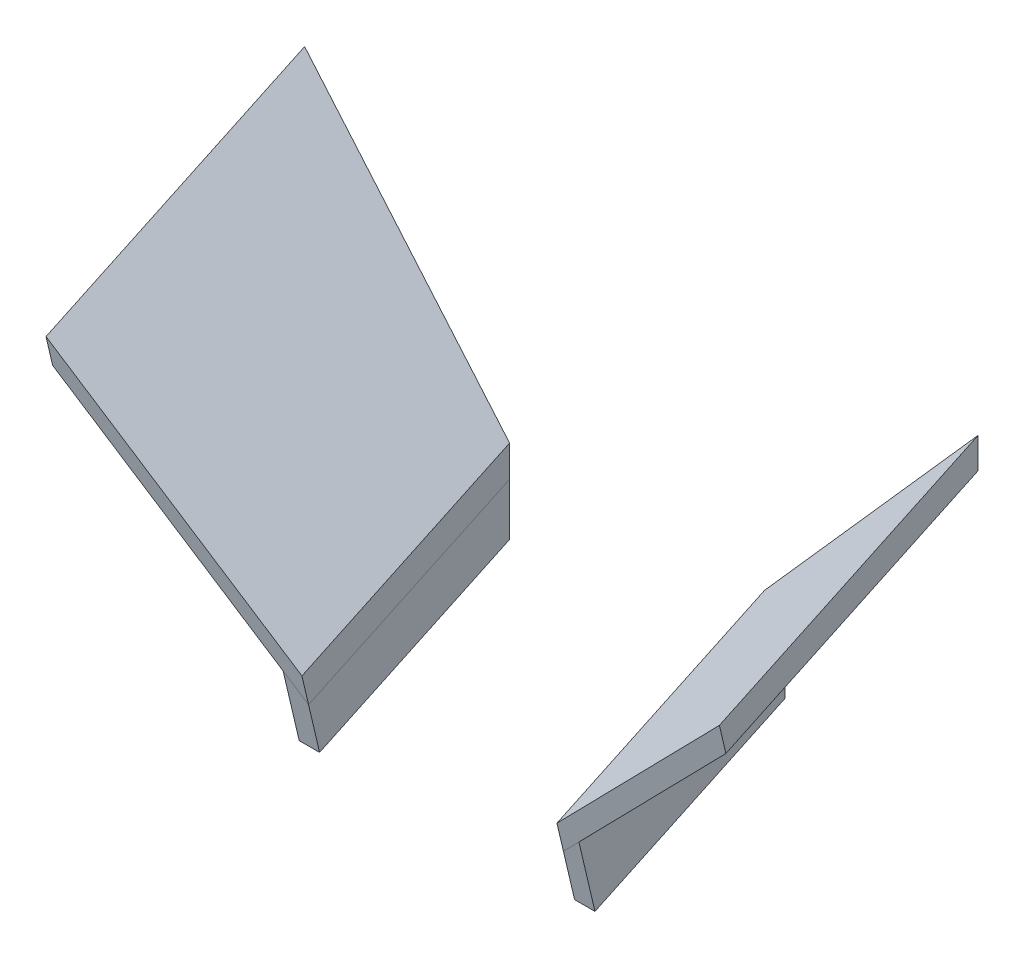
ISO-10303-21;
HEADER;
FILE_DESCRIPTION(('STEP AP214'),'2;1');
FILE_NAME('part.step','',(''),(''),'','','');
FILE_SCHEMA(('AUTOMOTIVE_DESIGN { 1 0 10303 214 1 1 1 1 }'));
ENDSEC;
DATA;
#1=APPLICATION_CONTEXT('core data for automotive mechanical design processes');
#2=APPLICATION_PROTOCOL_DEFINITION('international standard','automotive_design',2000,#1);
#3=PRODUCT_CONTEXT('',#1,'mechanical');
#4=PRODUCT('Part','Part','',(#3));
#5=PRODUCT_RELATED_PRODUCT_CATEGORY('part','',(#4));
#6=PRODUCT_DEFINITION_FORMATION('','',#4);
#7=PRODUCT_DEFINITION_CONTEXT('part definition',#1,'design');
#8=PRODUCT_DEFINITION('design','',#6,#7);
#9=PRODUCT_DEFINITION_SHAPE('','',#8);
#10=(LENGTH_UNIT() NAMED_UNIT(*) SI_UNIT(.MILLI.,.METRE.));
#11=(NAMED_UNIT(*) PLANE_ANGLE_UNIT() SI_UNIT($,.RADIAN.));
#12=(NAMED_UNIT(*) SI_UNIT($,.STERADIAN.) SOLID_ANGLE_UNIT());
#13=UNCERTAINTY_MEASURE_WITH_UNIT(LENGTH_MEASURE(1.E-05),#10,'distance_accuracy_value','');
#14=(GEOMETRIC_REPRESENTATION_CONTEXT(3) GLOBAL_UNCERTAINTY_ASSIGNED_CONTEXT((#13)) GLOBAL_UNIT_ASSIGNED_CONTEXT((#10,
#11,#12)) REPRESENTATION_CONTEXT('',''));
#15=CARTESIAN_POINT('',(0.,0.,0.));
#16=DIRECTION('',(0.,0.,1.));
#17=DIRECTION('',(1.,0.,0.));
#18=AXIS2_PLACEMENT_3D('',#15,#16,#17);
#19=CARTESIAN_POINT('',(-609.599999999917,189.561431206279,266.208589776236));
#20=DIRECTION('',(0.,-0.228725313452446,0.973491002005709));
#21=DIRECTION('',(-1.,0.,0.));
#22=AXIS2_PLACEMENT_3D('',#19,#20,#21);
#23=PLANE('',#22);
#24=DIRECTION('',(-1.,0.,0.));
#25=VECTOR('',#24,1.);
#26=CARTESIAN_POINT('',(-609.599999999917,-218.518699240679,170.328652973648));
#27=LINE('',#26,#25);
#28=CARTESIAN_POINT('',(-173.037499999917,-218.518699240679,170.328652973649));
#29=VERTEX_POINT('',#28);
#30=CARTESIAN_POINT('',(-191.293749999917,-218.518699240679,170.328652973648));
#31=VERTEX_POINT('',#30);
#32=EDGE_CURVE('E103',#29,#31,#27,.T.);
#33=ORIENTED_EDGE('',*,*,#32,.F.);
#34=DIRECTION('',(0.,-0.973491002005709,-0.228725313452446));
#35=VECTOR('',#34,1.);
#36=CARTESIAN_POINT('',(-173.037499999917,-105.971152820937,196.772115501932));
#37=LINE('',#36,#35);
#38=CARTESIAN_POINT('',(-173.037499999917,-157.427508899888,184.682254220184));
#39=VERTEX_POINT('',#38);
#40=EDGE_CURVE('E12',#39,#29,#37,.T.);
#41=ORIENTED_EDGE('',*,*,#40,.F.);
#42=DIRECTION('',(-0.691779980186067,-0.70296597437267,-0.165164457096698));
#43=VECTOR('',#42,1.);
#44=CARTESIAN_POINT('',(-66.7796089213839,-49.451441253763,210.051630893249));
#45=LINE('',#44,#43);
#46=CARTESIAN_POINT('',(-191.293749999917,-175.978960137592,180.323522099806));
#47=VERTEX_POINT('',#46);
#48=EDGE_CURVE('E98',#39,#47,#45,.T.);
#49=ORIENTED_EDGE('',*,*,#48,.T.);
#50=DIRECTION('',(0.,-0.973491002005709,-0.228725313452446));
#51=VECTOR('',#50,1.);
#52=CARTESIAN_POINT('',(-191.293749999917,-105.971152820937,196.772115501932));
#53=LINE('',#52,#51);
#54=EDGE_CURVE('E102',#47,#31,#53,.T.);
#55=ORIENTED_EDGE('',*,*,#54,.T.);
#56=EDGE_LOOP('',(#33,#41,#49,#55));
#57=FACE_BOUND('',#56,.T.);
#58=ADVANCED_FACE('F60',(#57),#23,.T.);
#59=CARTESIAN_POINT('',(0.,0.,0.));
#60=DIRECTION('',(0.,0.,1.));
#61=DIRECTION('',(1.,0.,0.));
#62=AXIS2_PLACEMENT_3D('',#59,#60,#61);
#63=PLANE('',#62);
#64=DIRECTION('',(0.,-1.,0.));
#65=VECTOR('',#64,1.);
#66=CARTESIAN_POINT('',(-173.037499999917,0.,0.));
#67=LINE('',#66,#65);
#68=CARTESIAN_POINT('',(-173.037499999917,-70.4358591762382,0.));
#69=VERTEX_POINT('',#68);
#70=CARTESIAN_POINT('',(-173.037499999917,-138.364039017786,0.));
#71=VERTEX_POINT('',#70);
#72=EDGE_CURVE('E110',#69,#71,#67,.T.);
#73=ORIENTED_EDGE('',*,*,#72,.T.);
#74=DIRECTION('',(1.,0.,0.));
#75=VECTOR('',#74,1.);
#76=CARTESIAN_POINT('',(-603.646875,-138.364039017786,-3.87855656383673E-13));
#77=LINE('',#76,#75);
#78=CARTESIAN_POINT('',(-191.293749999917,-138.364039017786,-1.22910208005818E-13));
#79=VERTEX_POINT('',#78);
#80=EDGE_CURVE('E76',#79,#71,#77,.T.);
#81=ORIENTED_EDGE('',*,*,#80,.F.);
#82=DIRECTION('',(0.,-1.,0.));
#83=VECTOR('',#82,1.);
#84=CARTESIAN_POINT('',(-191.293749999917,1.19448110160142E-13,0.));
#85=LINE('',#84,#83);
#86=CARTESIAN_POINT('',(-191.293749999917,-91.040422118995,0.));
#87=VERTEX_POINT('',#86);
#88=EDGE_CURVE('E109',#87,#79,#85,.T.);
#89=ORIENTED_EDGE('',*,*,#88,.F.);
#90=DIRECTION('',(-0.663167433478709,-0.748471078381297,0.));
#91=VECTOR('',#90,1.);
#92=CARTESIAN_POINT('',(-61.9754982176188,54.9121178876129,0.));
#93=LINE('',#92,#91);
#94=EDGE_CURVE('E68',#69,#87,#93,.T.);
#95=ORIENTED_EDGE('',*,*,#94,.F.);
#96=EDGE_LOOP('',(#73,#81,#89,#95));
#97=FACE_BOUND('',#96,.T.);
#98=ADVANCED_FACE('F133',(#97),#63,.F.);
#99=CARTESIAN_POINT('',(-191.293749999917,-119.192513358351,253.04431084039));
#100=DIRECTION('',(1.,0.,0.));
#101=DIRECTION('',(0.,1.,0.));
#102=AXIS2_PLACEMENT_3D('',#99,#100,#101);
#103=PLANE('',#102);
#104=ORIENTED_EDGE('',*,*,#88,.T.);
#105=DIRECTION('',(0.,-0.42579703632988,0.904818702200994));
#106=VECTOR('',#105,1.);
#107=CARTESIAN_POINT('',(-191.293749999917,-232.378341091693,199.780391907053));
#108=LINE('',#107,#106);
#109=EDGE_CURVE('E113',#79,#31,#108,.T.);
#110=ORIENTED_EDGE('',*,*,#109,.T.);
#111=ORIENTED_EDGE('',*,*,#54,.F.);
#112=DIRECTION('',(0.,0.426127276803473,-0.904663221295116));
#113=VECTOR('',#112,1.);
#114=CARTESIAN_POINT('',(-191.293749999917,-210.232935477346,253.04431084039));
#115=LINE('',#114,#113);
#116=EDGE_CURVE('E63',#47,#87,#115,.T.);
#117=ORIENTED_EDGE('',*,*,#116,.T.);
#118=EDGE_LOOP('',(#104,#110,#111,#117));
#119=FACE_BOUND('',#118,.T.);
#120=ADVANCED_FACE('F112',(#119),#103,.F.);
#121=CARTESIAN_POINT('',(-61.975498217619,-64.2803954707384,253.04431084039));
#122=DIRECTION('',(0.714426177411708,-0.633002647889575,-0.298165867922002));
#123=DIRECTION('',(0.663167433478709,0.748471078381298,0.));
#124=AXIS2_PLACEMENT_3D('',#121,#122,#123);
#125=PLANE('',#124);
#126=ORIENTED_EDGE('',*,*,#48,.F.);
#127=DIRECTION('',(0.,0.426127276803473,-0.904663221295116));
#128=VECTOR('',#127,1.);
#129=CARTESIAN_POINT('',(-173.037499999917,-189.628372534589,253.04431084039));
#130=LINE('',#129,#128);
#131=EDGE_CURVE('E85',#39,#69,#130,.T.);
#132=ORIENTED_EDGE('',*,*,#131,.T.);
#133=ORIENTED_EDGE('',*,*,#94,.T.);
#134=ORIENTED_EDGE('',*,*,#116,.F.);
#135=EDGE_LOOP('',(#126,#132,#133,#134));
#136=FACE_BOUND('',#135,.T.);
#137=ADVANCED_FACE('F105',(#136),#125,.F.);
#138=CARTESIAN_POINT('',(-173.037499999917,-119.192513358351,253.04431084039));
#139=DIRECTION('',(1.,0.,0.));
#140=DIRECTION('',(0.,0.,-1.));
#141=AXIS2_PLACEMENT_3D('',#138,#139,#140);
#142=PLANE('',#141);
#143=DIRECTION('',(0.,-0.42579703632988,0.904818702200994));
#144=VECTOR('',#143,1.);
#145=CARTESIAN_POINT('',(-173.037499999917,-138.364039017786,-1.11180188154635E-13));
#146=LINE('',#145,#144);
#147=EDGE_CURVE('E125',#71,#29,#146,.T.);
#148=ORIENTED_EDGE('',*,*,#147,.F.);
#149=ORIENTED_EDGE('',*,*,#72,.F.);
#150=ORIENTED_EDGE('',*,*,#131,.F.);
#151=ORIENTED_EDGE('',*,*,#40,.T.);
#152=EDGE_LOOP('',(#148,#149,#150,#151));
#153=FACE_BOUND('',#152,.T.);
#154=ADVANCED_FACE('F131',(#153),#142,.T.);
#155=CARTESIAN_POINT('',(-603.646875,-138.364039017786,-3.87855656383673E-13));
#156=DIRECTION('',(0.,0.904818702200994,0.42579703632988));
#157=DIRECTION('',(0.,-0.42579703632988,0.904818702200994));
#158=AXIS2_PLACEMENT_3D('',#155,#156,#157);
#159=PLANE('',#158);
#160=ORIENTED_EDGE('',*,*,#32,.T.);
#161=ORIENTED_EDGE('',*,*,#109,.F.);
#162=ORIENTED_EDGE('',*,*,#80,.T.);
#163=ORIENTED_EDGE('',*,*,#147,.T.);
#164=EDGE_LOOP('',(#160,#161,#162,#163));
#165=FACE_BOUND('',#164,.T.);
#166=ADVANCED_FACE('F127',(#165),#159,.F.);
#167=CLOSED_SHELL('',(#58,#98,#120,#137,#154,#166));
#168=MANIFOLD_SOLID_BREP('B2_NOT_SHOWN',#167);
#169=CARTESIAN_POINT('',(-288.754784271006,-364.952575901978,253.04431084039));
#170=DIRECTION('',(0.728338497084429,0.619891078335886,0.291989870824946));
#171=DIRECTION('',(-0.648135927567824,0.761524667621343,0.));
#172=AXIS2_PLACEMENT_3D('',#169,#170,#171);
#173=PLANE('',#172);
#174=DIRECTION('',(0.,0.426127276803473,-0.904663221295116));
#175=VECTOR('',#174,1.);
#176=CARTESIAN_POINT('',(-438.149999999917,-189.42127581019,253.04431084039));
#177=LINE('',#176,#175);
#178=CARTESIAN_POINT('',(-438.149999999917,-157.241048027369,184.726063892205));
#179=VERTEX_POINT('',#178);
#180=CARTESIAN_POINT('',(-438.149999999917,-70.2287624518382,0.));
#181=VERTEX_POINT('',#180);
#182=EDGE_CURVE('E252',#179,#181,#177,.T.);
#183=ORIENTED_EDGE('',*,*,#182,.F.);
#184=DIRECTION('',(0.677150882640662,-0.716337704578502,-0.1683061945924));
#185=VECTOR('',#184,1.);
#186=CARTESIAN_POINT('',(-276.679094390703,-328.056298875526,144.592388581179));
#187=LINE('',#186,#185);
#188=CARTESIAN_POINT('',(-419.893749999917,-176.553789920598,180.188463715056));
#189=VERTEX_POINT('',#188);
#190=EDGE_CURVE('E239',#179,#189,#187,.T.);
#191=ORIENTED_EDGE('',*,*,#190,.T.);
#192=DIRECTION('',(0.,0.426127276803473,-0.904663221295116));
#193=VECTOR('',#192,1.);
#194=CARTESIAN_POINT('',(-419.893749999917,-210.871382372608,253.04431084039));
#195=LINE('',#194,#193);
#196=CARTESIAN_POINT('',(-419.893749999917,-91.6788690142571,0.));
#197=VERTEX_POINT('',#196);
#198=EDGE_CURVE('E256',#189,#197,#195,.T.);
#199=ORIENTED_EDGE('',*,*,#198,.T.);
#200=DIRECTION('',(0.648135927567824,-0.761524667621343,0.));
#201=VECTOR('',#200,1.);
#202=CARTESIAN_POINT('',(-288.754784271006,-245.760062543627,0.));
#203=LINE('',#202,#201);
#204=EDGE_CURVE('E254',#181,#197,#203,.T.);
#205=ORIENTED_EDGE('',*,*,#204,.F.);
#206=EDGE_LOOP('',(#183,#191,#199,#205));
#207=FACE_BOUND('',#206,.T.);
#208=ADVANCED_FACE('F194',(#207),#173,.T.);
#209=CARTESIAN_POINT('',(-438.149999999917,-119.192513358351,253.04431084039));
#210=DIRECTION('',(1.,0.,0.));
#211=DIRECTION('',(0.,0.,-1.));
#212=AXIS2_PLACEMENT_3D('',#209,#210,#211);
#213=PLANE('',#212);
#214=DIRECTION('',(0.,-1.,0.));
#215=VECTOR('',#214,1.);
#216=CARTESIAN_POINT('',(-438.149999999917,0.,0.));
#217=LINE('',#216,#215);
#218=CARTESIAN_POINT('',(-438.149999999917,-138.364039017786,-2.81520476428332E-13));
#219=VERTEX_POINT('',#218);
#220=EDGE_CURVE('E246',#181,#219,#217,.T.);
#221=ORIENTED_EDGE('',*,*,#220,.T.);
#222=DIRECTION('',(0.,-0.42579703632988,0.904818702200994));
#223=VECTOR('',#222,1.);
#224=CARTESIAN_POINT('',(-438.149999999917,-232.378341091693,199.780391907053));
#225=LINE('',#224,#223);
#226=CARTESIAN_POINT('',(-438.149999999917,-218.518699240679,170.328652973648));
#227=VERTEX_POINT('',#226);
#228=EDGE_CURVE('E232',#219,#227,#225,.T.);
#229=ORIENTED_EDGE('',*,*,#228,.T.);
#230=DIRECTION('',(0.,-0.973491002005709,-0.228725313452446));
#231=VECTOR('',#230,1.);
#232=CARTESIAN_POINT('',(-438.149999999917,-105.971152820937,196.772115501932));
#233=LINE('',#232,#231);
#234=EDGE_CURVE('E260',#179,#227,#233,.T.);
#235=ORIENTED_EDGE('',*,*,#234,.F.);
#236=ORIENTED_EDGE('',*,*,#182,.T.);
#237=EDGE_LOOP('',(#221,#229,#235,#236));
#238=FACE_BOUND('',#237,.T.);
#239=ADVANCED_FACE('F250',(#238),#213,.F.);
#240=CARTESIAN_POINT('',(-419.893749999917,-119.192513358351,253.04431084039));
#241=DIRECTION('',(-1.,0.,0.));
#242=DIRECTION('',(0.,-1.,0.));
#243=AXIS2_PLACEMENT_3D('',#240,#241,#242);
#244=PLANE('',#243);
#245=DIRECTION('',(0.,0.973491002005709,0.228725313452446));
#246=VECTOR('',#245,1.);
#247=CARTESIAN_POINT('',(-419.893749999917,-105.971152820936,196.772115501932));
#248=LINE('',#247,#246);
#249=CARTESIAN_POINT('',(-419.893749999917,-218.518699240679,170.328652973648));
#250=VERTEX_POINT('',#249);
#251=EDGE_CURVE('E202',#250,#189,#248,.T.);
#252=ORIENTED_EDGE('',*,*,#251,.F.);
#253=DIRECTION('',(0.,0.42579703632988,-0.904818702200994));
#254=VECTOR('',#253,1.);
#255=CARTESIAN_POINT('',(-419.893749999917,-232.378341091693,199.780391907053));
#256=LINE('',#255,#254);
#257=CARTESIAN_POINT('',(-419.893749999917,-138.364039017786,-2.69790456577149E-13));
#258=VERTEX_POINT('',#257);
#259=EDGE_CURVE('E208',#250,#258,#256,.T.);
#260=ORIENTED_EDGE('',*,*,#259,.T.);
#261=DIRECTION('',(0.,1.,0.));
#262=VECTOR('',#261,1.);
#263=CARTESIAN_POINT('',(-419.893749999917,5.24382159956268E-13,0.));
#264=LINE('',#263,#262);
#265=EDGE_CURVE('E248',#258,#197,#264,.T.);
#266=ORIENTED_EDGE('',*,*,#265,.T.);
#267=ORIENTED_EDGE('',*,*,#198,.F.);
#268=EDGE_LOOP('',(#252,#260,#266,#267));
#269=FACE_BOUND('',#268,.T.);
#270=ADVANCED_FACE('F267',(#269),#244,.F.);
#271=CARTESIAN_POINT('',(0.,0.,0.));
#272=DIRECTION('',(0.,0.,1.));
#273=DIRECTION('',(1.,0.,0.));
#274=AXIS2_PLACEMENT_3D('',#271,#272,#273);
#275=PLANE('',#274);
#276=ORIENTED_EDGE('',*,*,#265,.F.);
#277=DIRECTION('',(1.,0.,0.));
#278=VECTOR('',#277,1.);
#279=CARTESIAN_POINT('',(-603.646875,-138.364039017786,-3.87855656383673E-13));
#280=LINE('',#279,#278);
#281=EDGE_CURVE('E235',#219,#258,#280,.T.);
#282=ORIENTED_EDGE('',*,*,#281,.F.);
#283=ORIENTED_EDGE('',*,*,#220,.F.);
#284=ORIENTED_EDGE('',*,*,#204,.T.);
#285=EDGE_LOOP('',(#276,#282,#283,#284));
#286=FACE_BOUND('',#285,.T.);
#287=ADVANCED_FACE('F244',(#286),#275,.F.);
#288=CARTESIAN_POINT('',(-609.599999999917,189.561431206279,266.208589776236));
#289=DIRECTION('',(0.,-0.228725313452446,0.973491002005709));
#290=DIRECTION('',(-1.,0.,0.));
#291=AXIS2_PLACEMENT_3D('',#288,#289,#290);
#292=PLANE('',#291);
#293=DIRECTION('',(-1.,0.,0.));
#294=VECTOR('',#293,1.);
#295=CARTESIAN_POINT('',(-609.599999999917,-218.518699240679,170.328652973648));
#296=LINE('',#295,#294);
#297=EDGE_CURVE('E58',#250,#227,#296,.T.);
#298=ORIENTED_EDGE('',*,*,#297,.F.);
#299=ORIENTED_EDGE('',*,*,#251,.T.);
#300=ORIENTED_EDGE('',*,*,#190,.F.);
#301=ORIENTED_EDGE('',*,*,#234,.T.);
#302=EDGE_LOOP('',(#298,#299,#300,#301));
#303=FACE_BOUND('',#302,.T.);
#304=ADVANCED_FACE('F196',(#303),#292,.T.);
#305=CARTESIAN_POINT('',(-603.646875,-138.364039017786,-3.87855656383673E-13));
#306=DIRECTION('',(0.,0.904818702200994,0.42579703632988));
#307=DIRECTION('',(0.,-0.42579703632988,0.904818702200994));
#308=AXIS2_PLACEMENT_3D('',#305,#306,#307);
#309=PLANE('',#308);
#310=ORIENTED_EDGE('',*,*,#281,.T.);
#311=ORIENTED_EDGE('',*,*,#259,.F.);
#312=ORIENTED_EDGE('',*,*,#297,.T.);
#313=ORIENTED_EDGE('',*,*,#228,.F.);
#314=EDGE_LOOP('',(#310,#311,#312,#313));
#315=FACE_BOUND('',#314,.T.);
#316=ADVANCED_FACE('F234',(#315),#309,.F.);
#317=CLOSED_SHELL('',(#208,#239,#270,#287,#304,#316));
#318=MANIFOLD_SOLID_BREP('B6',#317);
#319=CARTESIAN_POINT('',(-61.9754982176192,-175.556296081528,489.281745473094));
#320=DIRECTION('',(0.714426177411708,-0.633002647889575,-0.298165867922002));
#321=DIRECTION('',(0.663167433478709,0.748471078381297,0.));
#322=AXIS2_PLACEMENT_3D('',#319,#320,#321);
#323=PLANE('',#322);
#324=DIRECTION('',(0.,0.426127276803473,-0.904663221295116));
#325=VECTOR('',#324,1.);
#326=CARTESIAN_POINT('',(-2.31106958177186E-13,-105.608850470643,489.281745473094));
#327=LINE('',#326,#325);
#328=CARTESIAN_POINT('',(0.,18.4079854399998,225.995454317663));
#329=VERTEX_POINT('',#328);
#330=CARTESIAN_POINT('',(0.,124.859563498498,0.));
#331=VERTEX_POINT('',#330);
#332=EDGE_CURVE('E366',#329,#331,#327,.T.);
#333=ORIENTED_EDGE('',*,*,#332,.F.);
#334=DIRECTION('',(-0.691779980186067,-0.70296597437267,-0.165164457096698));
#335=VECTOR('',#334,1.);
#336=CARTESIAN_POINT('',(-93.9009428407817,-77.0113236889385,203.576334526143));
#337=LINE('',#336,#335);
#338=CARTESIAN_POINT('',(-191.293749999917,-175.978960137592,180.323522099806));
#339=VERTEX_POINT('',#338);
#340=EDGE_CURVE('E389',#329,#339,#337,.T.);
#341=ORIENTED_EDGE('',*,*,#340,.T.);
#342=DIRECTION('',(0.,0.426127276803473,-0.904663221295116));
#343=VECTOR('',#342,1.);
#344=CARTESIAN_POINT('',(-191.293749999917,-321.508836088136,489.281745473094));
#345=LINE('',#344,#343);
#346=CARTESIAN_POINT('',(-191.293749999917,-91.040422118995,0.));
#347=VERTEX_POINT('',#346);
#348=EDGE_CURVE('E331',#339,#347,#345,.T.);
#349=ORIENTED_EDGE('',*,*,#348,.T.);
#350=DIRECTION('',(-0.663167433478709,-0.748471078381297,0.));
#351=VECTOR('',#350,1.);
#352=CARTESIAN_POINT('',(-61.9754982176188,54.9121178876129,0.));
#353=LINE('',#352,#351);
#354=EDGE_CURVE('E401',#331,#347,#353,.T.);
#355=ORIENTED_EDGE('',*,*,#354,.F.);
#356=EDGE_LOOP('',(#333,#341,#349,#355));
#357=FACE_BOUND('',#356,.T.);
#358=ADVANCED_FACE('F327',(#357),#323,.T.);
#359=CARTESIAN_POINT('',(7.86267116451114E-12,-230.468413969141,489.281745473094));
#360=DIRECTION('',(1.,0.,0.));
#361=DIRECTION('',(0.,1.,0.));
#362=AXIS2_PLACEMENT_3D('',#359,#360,#361);
#363=PLANE('',#362);
#364=DIRECTION('',(0.,0.426127276803473,-0.904663221295116));
#365=VECTOR('',#364,1.);
#366=CARTESIAN_POINT('',(-1.93807485853836E-12,-78.0799805678614,489.281745473094));
#367=LINE('',#366,#365);
#368=CARTESIAN_POINT('',(-1.78144215178774E-12,43.1937811421144,231.818968740964));
#369=VERTEX_POINT('',#368);
#370=CARTESIAN_POINT('',(-1.62370117351429E-12,152.38843340128,0.));
#371=VERTEX_POINT('',#370);
#372=EDGE_CURVE('E379',#369,#371,#367,.T.);
#373=ORIENTED_EDGE('',*,*,#372,.F.);
#374=DIRECTION('',(0.,-0.973491002005709,-0.228725313452446));
#375=VECTOR('',#374,1.);
#376=CARTESIAN_POINT('',(1.27250415301033E-11,-158.824516917964,184.354022016526));
#377=LINE('',#376,#375);
#378=EDGE_CURVE('E372',#369,#329,#377,.T.);
#379=ORIENTED_EDGE('',*,*,#378,.T.);
#380=ORIENTED_EDGE('',*,*,#332,.T.);
#381=DIRECTION('',(0.,-1.,0.));
#382=VECTOR('',#381,1.);
#383=CARTESIAN_POINT('',(8.17704484953521E-12,0.,0.));
#384=LINE('',#383,#382);
#385=EDGE_CURVE('E337',#371,#331,#384,.T.);
#386=ORIENTED_EDGE('',*,*,#385,.F.);
#387=EDGE_LOOP('',(#373,#379,#380,#386));
#388=FACE_BOUND('',#387,.T.);
#389=ADVANCED_FACE('F383',(#388),#363,.T.);
#390=CARTESIAN_POINT('',(-75.6397733423185,-163.449345624082,489.281745473094));
#391=DIRECTION('',(-0.714426177411711,0.633002647889573,0.298165867922001));
#392=DIRECTION('',(-0.663167433478706,-0.7484710783813,0.));
#393=AXIS2_PLACEMENT_3D('',#390,#391,#392);
#394=PLANE('',#393);
#395=DIRECTION('',(0.,0.426127276803473,-0.904663221295116));
#396=VECTOR('',#395,1.);
#397=CARTESIAN_POINT('',(-191.293749999917,-293.97996618535,489.281745473094));
#398=LINE('',#397,#396);
#399=CARTESIAN_POINT('',(-191.293749999917,-151.193164435473,186.147036523108));
#400=VERTEX_POINT('',#399);
#401=CARTESIAN_POINT('',(-191.293749999917,-63.5115522162088,0.));
#402=VERTEX_POINT('',#401);
#403=EDGE_CURVE('E350',#400,#402,#398,.T.);
#404=ORIENTED_EDGE('',*,*,#403,.F.);
#405=DIRECTION('',(0.691779980186064,0.702965974372673,0.165164457096699));
#406=VECTOR('',#405,1.);
#407=CARTESIAN_POINT('',(-107.271186461572,-65.8119667443571,206.207664884963));
#408=LINE('',#407,#406);
#409=EDGE_CURVE('E376',#400,#369,#408,.T.);
#410=ORIENTED_EDGE('',*,*,#409,.T.);
#411=ORIENTED_EDGE('',*,*,#372,.T.);
#412=DIRECTION('',(0.663167433478706,0.7484710783813,0.));
#413=VECTOR('',#412,1.);
#414=CARTESIAN_POINT('',(-75.6397733423182,67.0190683450588,0.));
#415=LINE('',#414,#413);
#416=EDGE_CURVE('E405',#402,#371,#415,.T.);
#417=ORIENTED_EDGE('',*,*,#416,.F.);
#418=EDGE_LOOP('',(#404,#410,#411,#417));
#419=FACE_BOUND('',#418,.T.);
#420=ADVANCED_FACE('F377',(#419),#394,.T.);
#421=CARTESIAN_POINT('',(-191.293749999917,-230.468413969141,489.281745473094));
#422=DIRECTION('',(1.,0.,0.));
#423=DIRECTION('',(0.,1.,0.));
#424=AXIS2_PLACEMENT_3D('',#421,#422,#423);
#425=PLANE('',#424);
#426=DIRECTION('',(0.,-0.973491002005709,-0.228725313452446));
#427=VECTOR('',#426,1.);
#428=CARTESIAN_POINT('',(-191.293749999917,-158.824516917964,184.354022016526));
#429=LINE('',#428,#427);
#430=EDGE_CURVE('E192',#400,#339,#429,.T.);
#431=ORIENTED_EDGE('',*,*,#430,.F.);
#432=ORIENTED_EDGE('',*,*,#403,.T.);
#433=DIRECTION('',(0.,-1.,0.));
#434=VECTOR('',#433,1.);
#435=CARTESIAN_POINT('',(-191.293749999917,1.19448110160142E-13,0.));
#436=LINE('',#435,#434);
#437=EDGE_CURVE('E399',#402,#347,#436,.T.);
#438=ORIENTED_EDGE('',*,*,#437,.T.);
#439=ORIENTED_EDGE('',*,*,#348,.F.);
#440=EDGE_LOOP('',(#431,#432,#438,#439));
#441=FACE_BOUND('',#440,.T.);
#442=ADVANCED_FACE('F413',(#441),#425,.F.);
#443=CARTESIAN_POINT('',(0.,0.,0.));
#444=DIRECTION('',(0.,0.,1.));
#445=DIRECTION('',(1.,0.,0.));
#446=AXIS2_PLACEMENT_3D('',#443,#444,#445);
#447=PLANE('',#446);
#448=ORIENTED_EDGE('',*,*,#354,.T.);
#449=ORIENTED_EDGE('',*,*,#437,.F.);
#450=ORIENTED_EDGE('',*,*,#416,.T.);
#451=ORIENTED_EDGE('',*,*,#385,.T.);
#452=EDGE_LOOP('',(#448,#449,#450,#451));
#453=FACE_BOUND('',#452,.T.);
#454=ADVANCED_FACE('F411',(#453),#447,.F.);
#455=CARTESIAN_POINT('',(-609.599999999917,189.561431206279,266.208589776236));
#456=DIRECTION('',(0.,-0.228725313452446,0.973491002005709));
#457=DIRECTION('',(-1.,0.,0.));
#458=AXIS2_PLACEMENT_3D('',#455,#456,#457);
#459=PLANE('',#458);
#460=ORIENTED_EDGE('',*,*,#340,.F.);
#461=ORIENTED_EDGE('',*,*,#378,.F.);
#462=ORIENTED_EDGE('',*,*,#409,.F.);
#463=ORIENTED_EDGE('',*,*,#430,.T.);
#464=EDGE_LOOP('',(#460,#461,#462,#463));
#465=FACE_BOUND('',#464,.T.);
#466=ADVANCED_FACE('F329',(#465),#459,.T.);
#467=CLOSED_SHELL('',(#358,#389,#420,#442,#454,#466));
#468=MANIFOLD_SOLID_BREP('B52_NOT_SHOWN',#467);
#469=CARTESIAN_POINT('',(-288.754784270996,-476.228476512772,489.281745473094));
#470=DIRECTION('',(-0.728338497084411,-0.619891078335903,-0.291989870824954));
#471=DIRECTION('',(0.648135927567844,-0.761524667621326,0.));
#472=AXIS2_PLACEMENT_3D('',#469,#470,#471);
#473=PLANE('',#472);
#474=DIRECTION('',(0.,0.426127276803473,-0.904663221295116));
#475=VECTOR('',#474,1.);
#476=CARTESIAN_POINT('',(-419.893749999917,-322.147282983398,489.281745473094));
#477=LINE('',#476,#475);
#478=CARTESIAN_POINT('',(-419.893749999917,-176.553789920598,180.188463715056));
#479=VERTEX_POINT('',#478);
#480=CARTESIAN_POINT('',(-419.893749999917,-91.6788690142571,0.));
#481=VERTEX_POINT('',#480);
#482=EDGE_CURVE('E505',#479,#481,#477,.T.);
#483=ORIENTED_EDGE('',*,*,#482,.F.);
#484=DIRECTION('',(-0.677150882640681,0.716337704578485,0.168306194592396));
#485=VECTOR('',#484,1.);
#486=CARTESIAN_POINT('',(-249.626307481099,-356.674634573028,137.868404703144));
#487=LINE('',#486,#485);
#488=CARTESIAN_POINT('',(-603.646875,17.8331556569806,225.860395932909));
#489=VERTEX_POINT('',#488);
#490=EDGE_CURVE('E517',#479,#489,#487,.T.);
#491=ORIENTED_EDGE('',*,*,#490,.T.);
#492=DIRECTION('',(0.,0.426127276803473,-0.904663221295116));
#493=VECTOR('',#492,1.);
#494=CARTESIAN_POINT('',(-603.646875,-106.24729736592,489.281745473094));
#495=LINE('',#494,#493);
#496=CARTESIAN_POINT('',(-603.646874999999,124.221116603221,0.));
#497=VERTEX_POINT('',#496);
#498=EDGE_CURVE('E470',#489,#497,#495,.T.);
#499=ORIENTED_EDGE('',*,*,#498,.T.);
#500=DIRECTION('',(-0.648135927567844,0.761524667621326,0.));
#501=VECTOR('',#500,1.);
#502=CARTESIAN_POINT('',(-288.754784270995,-245.76006254363,0.));
#503=LINE('',#502,#501);
#504=EDGE_CURVE('E515',#481,#497,#503,.T.);
#505=ORIENTED_EDGE('',*,*,#504,.F.);
#506=EDGE_LOOP('',(#483,#491,#499,#505));
#507=FACE_BOUND('',#506,.T.);
#508=ADVANCED_FACE('F466',(#507),#473,.T.);
#509=CARTESIAN_POINT('',(-419.893749999917,-230.468413969141,489.281745473094));
#510=DIRECTION('',(-1.,0.,0.));
#511=DIRECTION('',(0.,-1.,0.));
#512=AXIS2_PLACEMENT_3D('',#509,#510,#511);
#513=PLANE('',#512);
#514=DIRECTION('',(0.,0.973491002005709,0.228725313452446));
#515=VECTOR('',#514,1.);
#516=CARTESIAN_POINT('',(-419.893749999917,-158.824516917964,184.354022016526));
#517=LINE('',#516,#515);
#518=CARTESIAN_POINT('',(-419.893749999917,-151.193164435473,186.147036523108));
#519=VERTEX_POINT('',#518);
#520=EDGE_CURVE('E511',#479,#519,#517,.T.);
#521=ORIENTED_EDGE('',*,*,#520,.F.);
#522=ORIENTED_EDGE('',*,*,#482,.T.);
#523=DIRECTION('',(0.,1.,0.));
#524=VECTOR('',#523,1.);
#525=CARTESIAN_POINT('',(-419.893749999917,5.24382159956268E-13,0.));
#526=LINE('',#525,#524);
#527=CARTESIAN_POINT('',(-419.893749999917,-63.5115522162087,0.));
#528=VERTEX_POINT('',#527);
#529=EDGE_CURVE('E525',#481,#528,#526,.T.);
#530=ORIENTED_EDGE('',*,*,#529,.T.);
#531=DIRECTION('',(0.,0.426127276803473,-0.904663221295116));
#532=VECTOR('',#531,1.);
#533=CARTESIAN_POINT('',(-419.893749999917,-293.97996618535,489.281745473094));
#534=LINE('',#533,#532);
#535=EDGE_CURVE('E535',#519,#528,#534,.T.);
#536=ORIENTED_EDGE('',*,*,#535,.F.);
#537=EDGE_LOOP('',(#521,#522,#530,#536));
#538=FACE_BOUND('',#537,.T.);
#539=ADVANCED_FACE('F539',(#538),#513,.F.);
#540=CARTESIAN_POINT('',(-274.852199557744,-464.395944985108,489.281745473094));
#541=DIRECTION('',(-0.728338497084428,-0.619891078335886,-0.291989870824946));
#542=DIRECTION('',(0.648135927567825,-0.761524667621342,0.));
#543=AXIS2_PLACEMENT_3D('',#540,#541,#542);
#544=PLANE('',#543);
#545=DIRECTION('',(-0.677150882640663,0.716337704578502,0.1683061945924));
#546=VECTOR('',#545,1.);
#547=CARTESIAN_POINT('',(-236.010363388933,-345.717909882691,140.442727715937));
#548=LINE('',#547,#546);
#549=CARTESIAN_POINT('',(-603.646875,43.1937811421148,231.818968740964));
#550=VERTEX_POINT('',#549);
#551=EDGE_CURVE('E475',#519,#550,#548,.T.);
#552=ORIENTED_EDGE('',*,*,#551,.F.);
#553=ORIENTED_EDGE('',*,*,#535,.T.);
#554=DIRECTION('',(-0.648135927567825,0.761524667621342,0.));
#555=VECTOR('',#554,1.);
#556=CARTESIAN_POINT('',(-274.852199557744,-233.927531015967,0.));
#557=LINE('',#556,#555);
#558=CARTESIAN_POINT('',(-603.646875,152.38843340128,0.));
#559=VERTEX_POINT('',#558);
#560=EDGE_CURVE('E536',#528,#559,#557,.T.);
#561=ORIENTED_EDGE('',*,*,#560,.T.);
#562=DIRECTION('',(0.,0.426127276803473,-0.904663221295116));
#563=VECTOR('',#562,1.);
#564=CARTESIAN_POINT('',(-603.646875,-78.0799805678611,489.281745473094));
#565=LINE('',#564,#563);
#566=EDGE_CURVE('E488',#550,#559,#565,.T.);
#567=ORIENTED_EDGE('',*,*,#566,.F.);
#568=EDGE_LOOP('',(#552,#553,#561,#567));
#569=FACE_BOUND('',#568,.T.);
#570=ADVANCED_FACE('F538',(#569),#544,.F.);
#571=CARTESIAN_POINT('',(-603.646874999998,-230.468413969148,489.281745473094));
#572=DIRECTION('',(1.,0.,0.));
#573=DIRECTION('',(0.,1.,0.));
#574=AXIS2_PLACEMENT_3D('',#571,#572,#573);
#575=PLANE('',#574);
#576=DIRECTION('',(0.,-0.973491002005709,-0.228725313452446));
#577=VECTOR('',#576,1.);
#578=CARTESIAN_POINT('',(-603.646874999997,-158.824516917971,184.354022016524));
#579=LINE('',#578,#577);
#580=EDGE_CURVE('E325',#550,#489,#579,.T.);
#581=ORIENTED_EDGE('',*,*,#580,.F.);
#582=ORIENTED_EDGE('',*,*,#566,.T.);
#583=DIRECTION('',(0.,-1.,0.));
#584=VECTOR('',#583,1.);
#585=CARTESIAN_POINT('',(-603.646874999998,-7.1378754054508E-12,0.));
#586=LINE('',#585,#584);
#587=EDGE_CURVE('E519',#559,#497,#586,.T.);
#588=ORIENTED_EDGE('',*,*,#587,.T.);
#589=ORIENTED_EDGE('',*,*,#498,.F.);
#590=EDGE_LOOP('',(#581,#582,#588,#589));
#591=FACE_BOUND('',#590,.T.);
#592=ADVANCED_FACE('F520',(#591),#575,.F.);
#593=CARTESIAN_POINT('',(0.,0.,0.));
#594=DIRECTION('',(0.,0.,1.));
#595=DIRECTION('',(1.,0.,0.));
#596=AXIS2_PLACEMENT_3D('',#593,#594,#595);
#597=PLANE('',#596);
#598=ORIENTED_EDGE('',*,*,#504,.T.);
#599=ORIENTED_EDGE('',*,*,#587,.F.);
#600=ORIENTED_EDGE('',*,*,#560,.F.);
#601=ORIENTED_EDGE('',*,*,#529,.F.);
#602=EDGE_LOOP('',(#598,#599,#600,#601));
#603=FACE_BOUND('',#602,.T.);
#604=ADVANCED_FACE('F524',(#603),#597,.F.);
#605=CARTESIAN_POINT('',(-609.599999999917,189.561431206279,266.208589776236));
#606=DIRECTION('',(0.,-0.228725313452446,0.973491002005709));
#607=DIRECTION('',(-1.,0.,0.));
#608=AXIS2_PLACEMENT_3D('',#605,#606,#607);
#609=PLANE('',#608);
#610=ORIENTED_EDGE('',*,*,#490,.F.);
#611=ORIENTED_EDGE('',*,*,#520,.T.);
#612=ORIENTED_EDGE('',*,*,#551,.T.);
#613=ORIENTED_EDGE('',*,*,#580,.T.);
#614=EDGE_LOOP('',(#610,#611,#612,#613));
#615=FACE_BOUND('',#614,.T.);
#616=ADVANCED_FACE('F468',(#615),#609,.T.);
#617=CLOSED_SHELL('',(#508,#539,#570,#592,#604,#616));
#618=MANIFOLD_SOLID_BREP('B186',#617);
#619=ADVANCED_BREP_SHAPE_REPRESENTATION('',(#18,#168,#318,#468,#618),#14);
#620=SHAPE_DEFINITION_REPRESENTATION(#9,#619);
ENDSEC;
END-ISO-10303-21;
